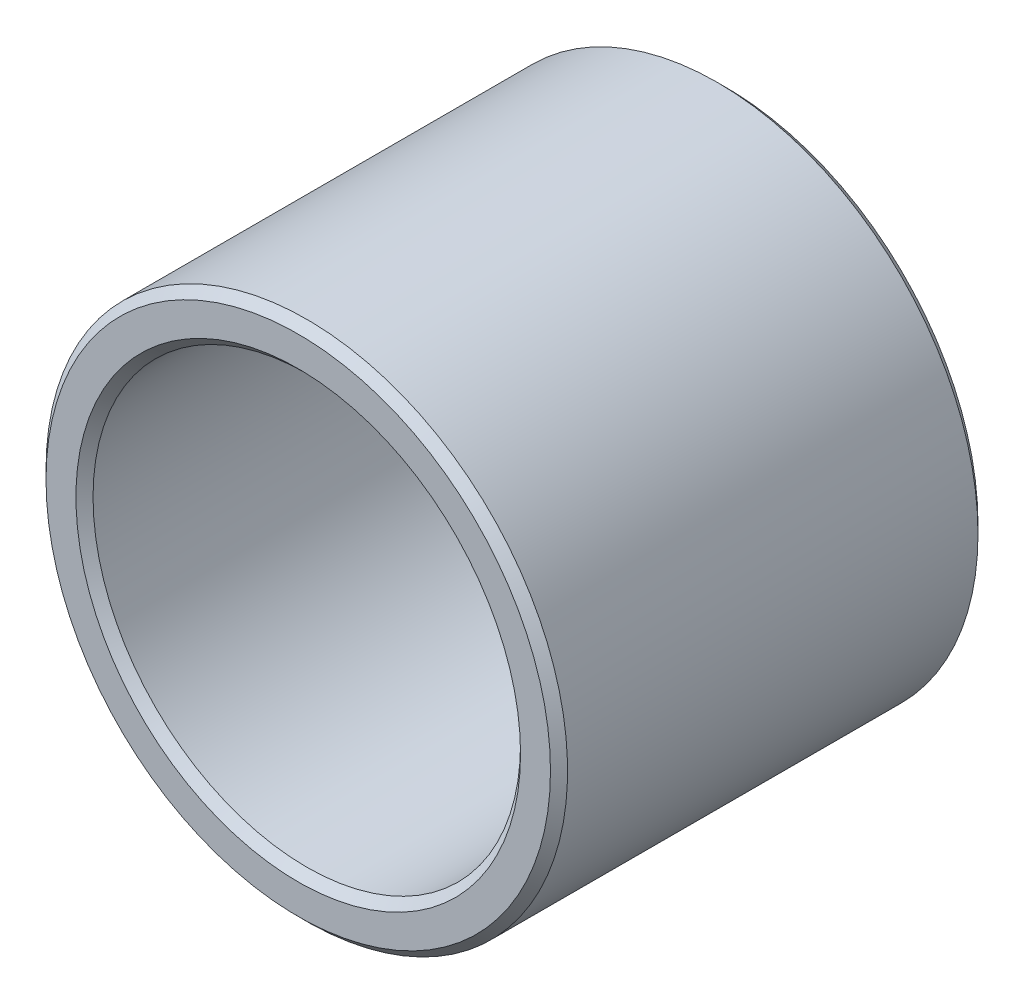
ISO-10303-21;
HEADER;
FILE_DESCRIPTION(('STEP AP214'),'2;1');
FILE_NAME('part.step','',(''),(''),'','','');
FILE_SCHEMA(('AUTOMOTIVE_DESIGN { 1 0 10303 214 1 1 1 1 }'));
ENDSEC;
DATA;
#1=APPLICATION_CONTEXT('core data for automotive mechanical design processes');
#2=APPLICATION_PROTOCOL_DEFINITION('international standard','automotive_design',2000,#1);
#3=PRODUCT_CONTEXT('',#1,'mechanical');
#4=PRODUCT('Part','Part','',(#3));
#5=PRODUCT_RELATED_PRODUCT_CATEGORY('part','',(#4));
#6=PRODUCT_DEFINITION_FORMATION('','',#4);
#7=PRODUCT_DEFINITION_CONTEXT('part definition',#1,'design');
#8=PRODUCT_DEFINITION('design','',#6,#7);
#9=PRODUCT_DEFINITION_SHAPE('','',#8);
#10=(LENGTH_UNIT() NAMED_UNIT(*) SI_UNIT(.MILLI.,.METRE.));
#11=(NAMED_UNIT(*) PLANE_ANGLE_UNIT() SI_UNIT($,.RADIAN.));
#12=(NAMED_UNIT(*) SI_UNIT($,.STERADIAN.) SOLID_ANGLE_UNIT());
#13=UNCERTAINTY_MEASURE_WITH_UNIT(LENGTH_MEASURE(1.E-05),#10,'distance_accuracy_value','');
#14=(GEOMETRIC_REPRESENTATION_CONTEXT(3) GLOBAL_UNCERTAINTY_ASSIGNED_CONTEXT((#13)) GLOBAL_UNIT_ASSIGNED_CONTEXT((#10,
#11,#12)) REPRESENTATION_CONTEXT('',''));
#15=CARTESIAN_POINT('',(0.,0.,0.));
#16=DIRECTION('',(0.,0.,1.));
#17=DIRECTION('',(1.,0.,0.));
#18=AXIS2_PLACEMENT_3D('',#15,#16,#17);
#19=CARTESIAN_POINT('',(0.,0.,12.7));
#20=DIRECTION('',(0.,0.,-1.));
#21=DIRECTION('',(-1.,0.,0.));
#22=AXIS2_PLACEMENT_3D('',#19,#20,#21);
#23=CYLINDRICAL_SURFACE('',#22,6.35);
#24=CARTESIAN_POINT('',(0.,0.,0.253999999983989));
#25=DIRECTION('',(0.,0.,-1.));
#26=DIRECTION('',(-1.,0.,0.));
#27=AXIS2_PLACEMENT_3D('',#24,#25,#26);
#28=CIRCLE('',#27,6.34999999999764);
#29=CARTESIAN_POINT('',(-6.34999999999764,0.,0.253999999983989));
#30=VERTEX_POINT('',#29);
#31=EDGE_CURVE('E29',#30,#30,#28,.T.);
#32=ORIENTED_EDGE('',*,*,#31,.T.);
#33=EDGE_LOOP('',(#32));
#34=FACE_BOUND('',#33,.T.);
#35=CARTESIAN_POINT('',(0.,0.,12.4460000000113));
#36=DIRECTION('',(0.,0.,1.));
#37=DIRECTION('',(1.,0.,0.));
#38=AXIS2_PLACEMENT_3D('',#35,#36,#37);
#39=CIRCLE('',#38,6.35000000005448);
#40=CARTESIAN_POINT('',(6.35000000005448,0.,12.4460000000113));
#41=VERTEX_POINT('',#40);
#42=EDGE_CURVE('E32',#41,#41,#39,.T.);
#43=ORIENTED_EDGE('',*,*,#42,.T.);
#44=EDGE_LOOP('',(#43));
#45=FACE_BOUND('',#44,.T.);
#46=ADVANCED_FACE('F14',(#34,#45),#23,.F.);
#47=CARTESIAN_POINT('',(0.,0.,12.6999999999953));
#48=DIRECTION('',(0.,0.,1.));
#49=DIRECTION('',(1.,0.,0.));
#50=AXIS2_PLACEMENT_3D('',#47,#48,#49);
#51=CONICAL_SURFACE('',#50,6.60400000003847,0.785398163397448);
#52=ORIENTED_EDGE('',*,*,#42,.F.);
#53=EDGE_LOOP('',(#52));
#54=FACE_BOUND('',#53,.T.);
#55=CARTESIAN_POINT('',(0.,0.,12.6999999999953));
#56=DIRECTION('',(0.,0.,1.));
#57=DIRECTION('',(1.,0.,0.));
#58=AXIS2_PLACEMENT_3D('',#55,#56,#57);
#59=CIRCLE('',#58,6.60400000003847);
#60=CARTESIAN_POINT('',(6.60400000003847,0.,12.6999999999953));
#61=VERTEX_POINT('',#60);
#62=EDGE_CURVE('E17',#61,#61,#59,.F.);
#63=ORIENTED_EDGE('',*,*,#62,.F.);
#64=EDGE_LOOP('',(#63));
#65=FACE_BOUND('',#64,.T.);
#66=ADVANCED_FACE('F48',(#54,#65),#51,.F.);
#67=CARTESIAN_POINT('',(0.,0.,0.));
#68=DIRECTION('',(0.,0.,-1.));
#69=DIRECTION('',(-1.,0.,0.));
#70=AXIS2_PLACEMENT_3D('',#67,#68,#69);
#71=CONICAL_SURFACE('',#70,6.60399999998162,0.785398163397448);
#72=CARTESIAN_POINT('',(0.,0.,0.));
#73=DIRECTION('',(0.,0.,-1.));
#74=DIRECTION('',(-1.,0.,0.));
#75=AXIS2_PLACEMENT_3D('',#72,#73,#74);
#76=CIRCLE('',#75,6.60399999998162);
#77=CARTESIAN_POINT('',(-6.60399999998162,0.,0.));
#78=VERTEX_POINT('',#77);
#79=EDGE_CURVE('E39',#78,#78,#76,.T.);
#80=ORIENTED_EDGE('',*,*,#79,.T.);
#81=EDGE_LOOP('',(#80));
#82=FACE_BOUND('',#81,.T.);
#83=ORIENTED_EDGE('',*,*,#31,.F.);
#84=EDGE_LOOP('',(#83));
#85=FACE_BOUND('',#84,.T.);
#86=ADVANCED_FACE('F50',(#82,#85),#71,.F.);
#87=CARTESIAN_POINT('',(0.,0.,12.7));
#88=DIRECTION('',(0.,0.,1.));
#89=DIRECTION('',(1.,0.,0.));
#90=AXIS2_PLACEMENT_3D('',#87,#88,#89);
#91=PLANE('',#90);
#92=CARTESIAN_POINT('',(0.,0.,12.7));
#93=DIRECTION('',(0.,0.,-1.));
#94=DIRECTION('',(-1.,0.,0.));
#95=AXIS2_PLACEMENT_3D('',#92,#93,#94);
#96=CIRCLE('',#95,7.493);
#97=CARTESIAN_POINT('',(-7.493,0.,12.7));
#98=VERTEX_POINT('',#97);
#99=EDGE_CURVE('E37',#98,#98,#96,.T.);
#100=ORIENTED_EDGE('',*,*,#99,.F.);
#101=EDGE_LOOP('',(#100));
#102=FACE_BOUND('',#101,.T.);
#103=ORIENTED_EDGE('',*,*,#62,.T.);
#104=EDGE_LOOP('',(#103));
#105=FACE_BOUND('',#104,.T.);
#106=ADVANCED_FACE('F46',(#102,#105),#91,.T.);
#107=CARTESIAN_POINT('',(0.,0.,0.));
#108=DIRECTION('',(0.,0.,1.));
#109=DIRECTION('',(1.,0.,0.));
#110=AXIS2_PLACEMENT_3D('',#107,#108,#109);
#111=PLANE('',#110);
#112=CARTESIAN_POINT('',(0.,0.,0.));
#113=DIRECTION('',(0.,0.,1.));
#114=DIRECTION('',(1.,0.,0.));
#115=AXIS2_PLACEMENT_3D('',#112,#113,#114);
#116=CIRCLE('',#115,7.493);
#117=CARTESIAN_POINT('',(7.493,0.,0.));
#118=VERTEX_POINT('',#117);
#119=EDGE_CURVE('E26',#118,#118,#116,.T.);
#120=ORIENTED_EDGE('',*,*,#119,.F.);
#121=EDGE_LOOP('',(#120));
#122=FACE_BOUND('',#121,.T.);
#123=ORIENTED_EDGE('',*,*,#79,.F.);
#124=EDGE_LOOP('',(#123));
#125=FACE_BOUND('',#124,.T.);
#126=ADVANCED_FACE('F74',(#122,#125),#111,.F.);
#127=CARTESIAN_POINT('',(0.,0.,12.446));
#128=DIRECTION('',(0.,0.,-1.));
#129=DIRECTION('',(-1.,0.,0.));
#130=AXIS2_PLACEMENT_3D('',#127,#128,#129);
#131=CONICAL_SURFACE('',#130,7.747,0.78539816339745);
#132=CARTESIAN_POINT('',(0.,0.,12.446));
#133=DIRECTION('',(0.,0.,-1.));
#134=DIRECTION('',(-1.,0.,0.));
#135=AXIS2_PLACEMENT_3D('',#132,#133,#134);
#136=CIRCLE('',#135,7.747);
#137=CARTESIAN_POINT('',(-7.747,0.,12.446));
#138=VERTEX_POINT('',#137);
#139=EDGE_CURVE('E21',#138,#138,#136,.T.);
#140=ORIENTED_EDGE('',*,*,#139,.F.);
#141=EDGE_LOOP('',(#140));
#142=FACE_BOUND('',#141,.T.);
#143=ORIENTED_EDGE('',*,*,#99,.T.);
#144=EDGE_LOOP('',(#143));
#145=FACE_BOUND('',#144,.T.);
#146=ADVANCED_FACE('F67',(#142,#145),#131,.T.);
#147=CARTESIAN_POINT('',(0.,0.,0.254000000000001));
#148=DIRECTION('',(0.,0.,1.));
#149=DIRECTION('',(1.,0.,0.));
#150=AXIS2_PLACEMENT_3D('',#147,#148,#149);
#151=CONICAL_SURFACE('',#150,7.747,0.78539816339745);
#152=CARTESIAN_POINT('',(0.,0.,0.254000000000001));
#153=DIRECTION('',(0.,0.,-1.));
#154=DIRECTION('',(-1.,0.,0.));
#155=AXIS2_PLACEMENT_3D('',#152,#153,#154);
#156=CIRCLE('',#155,7.747);
#157=CARTESIAN_POINT('',(-7.747,0.,0.254000000000001));
#158=VERTEX_POINT('',#157);
#159=EDGE_CURVE('E10',#158,#158,#156,.F.);
#160=ORIENTED_EDGE('',*,*,#159,.F.);
#161=EDGE_LOOP('',(#160));
#162=FACE_BOUND('',#161,.T.);
#163=ORIENTED_EDGE('',*,*,#119,.T.);
#164=EDGE_LOOP('',(#163));
#165=FACE_BOUND('',#164,.T.);
#166=ADVANCED_FACE('F62',(#162,#165),#151,.T.);
#167=CARTESIAN_POINT('',(0.,0.,12.7));
#168=DIRECTION('',(0.,0.,-1.));
#169=DIRECTION('',(-1.,0.,0.));
#170=AXIS2_PLACEMENT_3D('',#167,#168,#169);
#171=CYLINDRICAL_SURFACE('',#170,7.747);
#172=ORIENTED_EDGE('',*,*,#159,.T.);
#173=EDGE_LOOP('',(#172));
#174=FACE_BOUND('',#173,.T.);
#175=ORIENTED_EDGE('',*,*,#139,.T.);
#176=EDGE_LOOP('',(#175));
#177=FACE_BOUND('',#176,.T.);
#178=ADVANCED_FACE('F60',(#174,#177),#171,.T.);
#179=CLOSED_SHELL('',(#46,#66,#86,#106,#126,#146,#166,#178));
#180=MANIFOLD_SOLID_BREP('B1',#179);
#181=ADVANCED_BREP_SHAPE_REPRESENTATION('',(#18,#180),#14);
#182=SHAPE_DEFINITION_REPRESENTATION(#9,#181);
ENDSEC;
END-ISO-10303-21;
